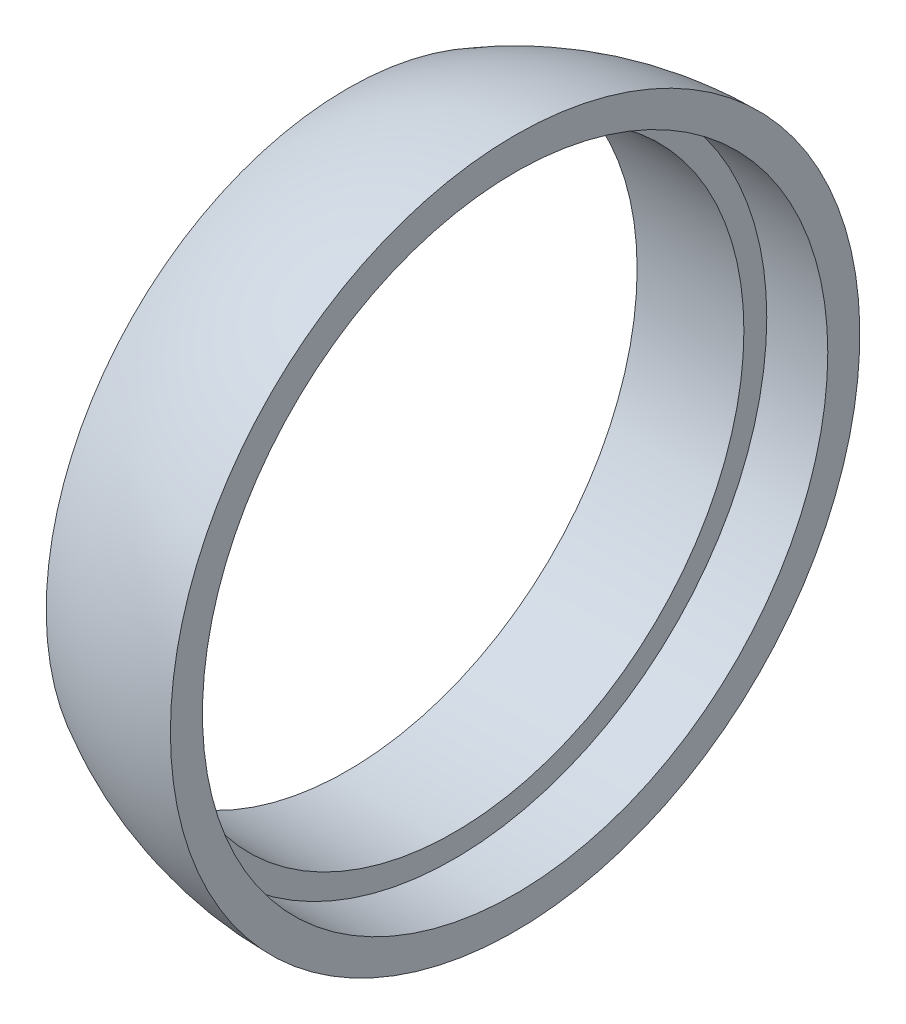
ISO-10303-21;
HEADER;
FILE_DESCRIPTION(('STEP AP214'),'2;1');
FILE_NAME('part.step','',(''),(''),'','','');
FILE_SCHEMA(('AUTOMOTIVE_DESIGN { 1 0 10303 214 1 1 1 1 }'));
ENDSEC;
DATA;
#1=APPLICATION_CONTEXT('core data for automotive mechanical design processes');
#2=APPLICATION_PROTOCOL_DEFINITION('international standard','automotive_design',2000,#1);
#3=PRODUCT_CONTEXT('',#1,'mechanical');
#4=PRODUCT('Part','Part','',(#3));
#5=PRODUCT_RELATED_PRODUCT_CATEGORY('part','',(#4));
#6=PRODUCT_DEFINITION_FORMATION('','',#4);
#7=PRODUCT_DEFINITION_CONTEXT('part definition',#1,'design');
#8=PRODUCT_DEFINITION('design','',#6,#7);
#9=PRODUCT_DEFINITION_SHAPE('','',#8);
#10=(LENGTH_UNIT() NAMED_UNIT(*) SI_UNIT(.MILLI.,.METRE.));
#11=(NAMED_UNIT(*) PLANE_ANGLE_UNIT() SI_UNIT($,.RADIAN.));
#12=(NAMED_UNIT(*) SI_UNIT($,.STERADIAN.) SOLID_ANGLE_UNIT());
#13=UNCERTAINTY_MEASURE_WITH_UNIT(LENGTH_MEASURE(1.E-05),#10,'distance_accuracy_value','');
#14=(GEOMETRIC_REPRESENTATION_CONTEXT(3) GLOBAL_UNCERTAINTY_ASSIGNED_CONTEXT((#13)) GLOBAL_UNIT_ASSIGNED_CONTEXT((#10,
#11,#12)) REPRESENTATION_CONTEXT('',''));
#15=CARTESIAN_POINT('',(0.,0.,0.));
#16=DIRECTION('',(0.,0.,1.));
#17=DIRECTION('',(1.,0.,0.));
#18=AXIS2_PLACEMENT_3D('',#15,#16,#17);
#19=CARTESIAN_POINT('',(-5.5,0.,0.));
#20=DIRECTION('',(1.,0.,0.));
#21=DIRECTION('',(0.,0.,-1.));
#22=AXIS2_PLACEMENT_3D('',#19,#20,#21);
#23=CYLINDRICAL_SURFACE('',#22,9.5);
#24=CARTESIAN_POINT('',(-5.5,0.,0.));
#25=DIRECTION('',(1.,0.,0.));
#26=DIRECTION('',(0.,0.,-1.));
#27=AXIS2_PLACEMENT_3D('',#24,#25,#26);
#28=CIRCLE('',#27,9.5);
#29=CARTESIAN_POINT('',(-5.5,0.,-9.5));
#30=VERTEX_POINT('',#29);
#31=EDGE_CURVE('E58',#30,#30,#28,.T.);
#32=ORIENTED_EDGE('',*,*,#31,.F.);
#33=EDGE_LOOP('',(#32));
#34=FACE_BOUND('',#33,.T.);
#35=CARTESIAN_POINT('',(-2.,0.,0.));
#36=DIRECTION('',(1.,0.,0.));
#37=DIRECTION('',(0.,0.,-1.));
#38=AXIS2_PLACEMENT_3D('',#35,#36,#37);
#39=CIRCLE('',#38,9.5);
#40=CARTESIAN_POINT('',(-2.,0.,-9.5));
#41=VERTEX_POINT('',#40);
#42=EDGE_CURVE('E47',#41,#41,#39,.F.);
#43=ORIENTED_EDGE('',*,*,#42,.F.);
#44=EDGE_LOOP('',(#43));
#45=FACE_BOUND('',#44,.T.);
#46=ADVANCED_FACE('F43',(#34,#45),#23,.F.);
#47=CARTESIAN_POINT('',(0.,0.,0.));
#48=DIRECTION('',(0.,1.,0.));
#49=DIRECTION('',(0.,0.,1.));
#50=AXIS2_PLACEMENT_3D('',#47,#48,#49);
#51=SPHERICAL_SURFACE('',#50,11.3);
#52=CARTESIAN_POINT('',(0.,0.,0.));
#53=DIRECTION('',(1.,0.,0.));
#54=DIRECTION('',(0.,1.,0.));
#55=AXIS2_PLACEMENT_3D('',#52,#53,#54);
#56=SPHERICAL_SURFACE('',#55,11.3);
#57=CARTESIAN_POINT('',(-5.5,0.,0.));
#58=DIRECTION('',(1.,0.,0.));
#59=DIRECTION('',(0.,1.,0.));
#60=AXIS2_PLACEMENT_3D('',#57,#58,#59);
#61=CIRCLE('',#60,9.87117014340246);
#62=CARTESIAN_POINT('',(-5.5,9.87117014340246,0.));
#63=VERTEX_POINT('',#62);
#64=EDGE_CURVE('E52',#63,#63,#61,.F.);
#65=ORIENTED_EDGE('',*,*,#64,.F.);
#66=EDGE_LOOP('',(#65));
#67=FACE_BOUND('',#66,.T.);
#68=CARTESIAN_POINT('',(0.,0.,0.));
#69=DIRECTION('',(-1.,0.,0.));
#70=DIRECTION('',(0.,0.,1.));
#71=AXIS2_PLACEMENT_3D('',#68,#69,#70);
#72=CIRCLE('',#71,11.3);
#73=CARTESIAN_POINT('',(0.,0.,11.3));
#74=VERTEX_POINT('',#73);
#75=EDGE_CURVE('E10',#74,#74,#72,.T.);
#76=ORIENTED_EDGE('',*,*,#75,.T.);
#77=EDGE_LOOP('',(#76));
#78=FACE_BOUND('',#77,.T.);
#79=ADVANCED_FACE('F45',(#67,#78),#56,.T.);
#80=CARTESIAN_POINT('',(0.,0.,0.));
#81=DIRECTION('',(-1.,0.,0.));
#82=DIRECTION('',(0.,0.,1.));
#83=AXIS2_PLACEMENT_3D('',#80,#81,#82);
#84=PLANE('',#83);
#85=CARTESIAN_POINT('',(0.,0.,0.));
#86=DIRECTION('',(1.,0.,0.));
#87=DIRECTION('',(0.,0.,-1.));
#88=AXIS2_PLACEMENT_3D('',#85,#86,#87);
#89=CIRCLE('',#88,10.25);
#90=CARTESIAN_POINT('',(0.,0.,-10.25));
#91=VERTEX_POINT('',#90);
#92=EDGE_CURVE('E63',#91,#91,#89,.T.);
#93=ORIENTED_EDGE('',*,*,#92,.F.);
#94=EDGE_LOOP('',(#93));
#95=FACE_BOUND('',#94,.T.);
#96=ORIENTED_EDGE('',*,*,#75,.F.);
#97=EDGE_LOOP('',(#96));
#98=FACE_BOUND('',#97,.T.);
#99=ADVANCED_FACE('F86',(#95,#98),#84,.F.);
#100=CARTESIAN_POINT('',(-5.5,10.0969652894565,-11.3));
#101=DIRECTION('',(1.,0.,0.));
#102=DIRECTION('',(0.,1.,0.));
#103=AXIS2_PLACEMENT_3D('',#100,#101,#102);
#104=PLANE('',#103);
#105=ORIENTED_EDGE('',*,*,#31,.T.);
#106=EDGE_LOOP('',(#105));
#107=FACE_BOUND('',#106,.T.);
#108=ORIENTED_EDGE('',*,*,#64,.T.);
#109=EDGE_LOOP('',(#108));
#110=FACE_BOUND('',#109,.T.);
#111=ADVANCED_FACE('F93',(#107,#110),#104,.F.);
#112=CARTESIAN_POINT('',(-2.,0.,0.));
#113=DIRECTION('',(1.,0.,0.));
#114=DIRECTION('',(0.,0.,-1.));
#115=AXIS2_PLACEMENT_3D('',#112,#113,#114);
#116=PLANE('',#115);
#117=CARTESIAN_POINT('',(-2.,0.,0.));
#118=DIRECTION('',(1.,0.,0.));
#119=DIRECTION('',(0.,0.,-1.));
#120=AXIS2_PLACEMENT_3D('',#117,#118,#119);
#121=CIRCLE('',#120,10.25);
#122=CARTESIAN_POINT('',(-2.,0.,-10.25));
#123=VERTEX_POINT('',#122);
#124=EDGE_CURVE('E67',#123,#123,#121,.T.);
#125=ORIENTED_EDGE('',*,*,#124,.T.);
#126=EDGE_LOOP('',(#125));
#127=FACE_BOUND('',#126,.T.);
#128=ORIENTED_EDGE('',*,*,#42,.T.);
#129=EDGE_LOOP('',(#128));
#130=FACE_BOUND('',#129,.T.);
#131=ADVANCED_FACE('F76',(#127,#130),#116,.T.);
#132=CARTESIAN_POINT('',(-2.,0.,0.));
#133=DIRECTION('',(1.,0.,0.));
#134=DIRECTION('',(0.,0.,-1.));
#135=AXIS2_PLACEMENT_3D('',#132,#133,#134);
#136=CYLINDRICAL_SURFACE('',#135,10.25);
#137=ORIENTED_EDGE('',*,*,#124,.F.);
#138=EDGE_LOOP('',(#137));
#139=FACE_BOUND('',#138,.T.);
#140=ORIENTED_EDGE('',*,*,#92,.T.);
#141=EDGE_LOOP('',(#140));
#142=FACE_BOUND('',#141,.T.);
#143=ADVANCED_FACE('F91',(#139,#142),#136,.F.);
#144=CLOSED_SHELL('',(#46,#79,#99,#111,#131,#143));
#145=MANIFOLD_SOLID_BREP('B2',#144);
#146=ADVANCED_BREP_SHAPE_REPRESENTATION('',(#18,#145),#14);
#147=SHAPE_DEFINITION_REPRESENTATION(#9,#146);
ENDSEC;
END-ISO-10303-21;
